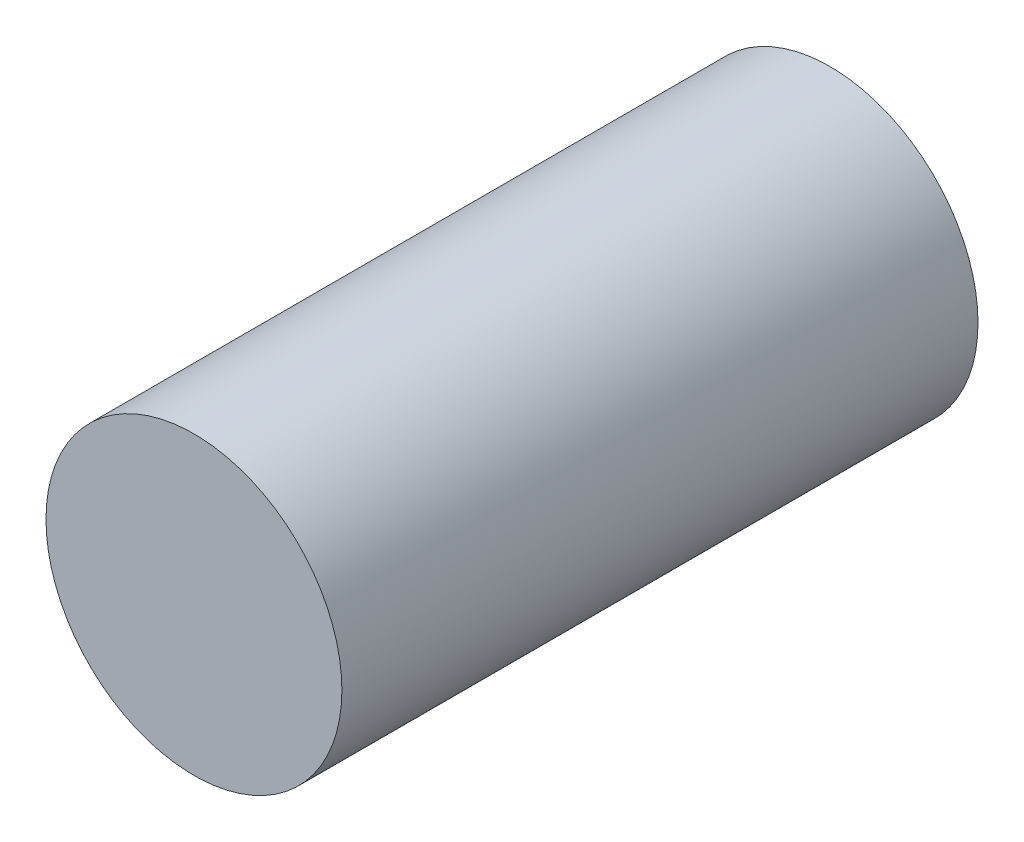
ISO-10303-21;
HEADER;
FILE_DESCRIPTION(('STEP AP214'),'2;1');
FILE_NAME('part.step','',(''),(''),'','','');
FILE_SCHEMA(('AUTOMOTIVE_DESIGN { 1 0 10303 214 1 1 1 1 }'));
ENDSEC;
DATA;
#1=APPLICATION_CONTEXT('core data for automotive mechanical design processes');
#2=APPLICATION_PROTOCOL_DEFINITION('international standard','automotive_design',2000,#1);
#3=PRODUCT_CONTEXT('',#1,'mechanical');
#4=PRODUCT('Part','Part','',(#3));
#5=PRODUCT_RELATED_PRODUCT_CATEGORY('part','',(#4));
#6=PRODUCT_DEFINITION_FORMATION('','',#4);
#7=PRODUCT_DEFINITION_CONTEXT('part definition',#1,'design');
#8=PRODUCT_DEFINITION('design','',#6,#7);
#9=PRODUCT_DEFINITION_SHAPE('','',#8);
#10=(LENGTH_UNIT() NAMED_UNIT(*) SI_UNIT(.MILLI.,.METRE.));
#11=(NAMED_UNIT(*) PLANE_ANGLE_UNIT() SI_UNIT($,.RADIAN.));
#12=(NAMED_UNIT(*) SI_UNIT($,.STERADIAN.) SOLID_ANGLE_UNIT());
#13=UNCERTAINTY_MEASURE_WITH_UNIT(LENGTH_MEASURE(1.E-05),#10,'distance_accuracy_value','');
#14=(GEOMETRIC_REPRESENTATION_CONTEXT(3) GLOBAL_UNCERTAINTY_ASSIGNED_CONTEXT((#13)) GLOBAL_UNIT_ASSIGNED_CONTEXT((#10,
#11,#12)) REPRESENTATION_CONTEXT('',''));
#15=CARTESIAN_POINT('',(0.,0.,0.));
#16=DIRECTION('',(0.,0.,1.));
#17=DIRECTION('',(1.,0.,0.));
#18=AXIS2_PLACEMENT_3D('',#15,#16,#17);
#19=CARTESIAN_POINT('',(0.,0.,27.3));
#20=DIRECTION('',(0.,0.,-1.));
#21=DIRECTION('',(-1.,0.,0.));
#22=AXIS2_PLACEMENT_3D('',#19,#20,#21);
#23=CYLINDRICAL_SURFACE('',#22,6.35);
#24=CARTESIAN_POINT('',(0.,0.,27.3));
#25=DIRECTION('',(0.,0.,1.));
#26=DIRECTION('',(1.,0.,0.));
#27=AXIS2_PLACEMENT_3D('',#24,#25,#26);
#28=CIRCLE('',#27,6.35);
#29=CARTESIAN_POINT('',(6.35,0.,27.3));
#30=VERTEX_POINT('',#29);
#31=EDGE_CURVE('E10',#30,#30,#28,.T.);
#32=ORIENTED_EDGE('',*,*,#31,.F.);
#33=EDGE_LOOP('',(#32));
#34=FACE_BOUND('',#33,.T.);
#35=CARTESIAN_POINT('',(0.,0.,0.));
#36=DIRECTION('',(0.,0.,1.));
#37=DIRECTION('',(1.,0.,0.));
#38=AXIS2_PLACEMENT_3D('',#35,#36,#37);
#39=CIRCLE('',#38,6.35);
#40=CARTESIAN_POINT('',(6.35,0.,0.));
#41=VERTEX_POINT('',#40);
#42=EDGE_CURVE('E42',#41,#41,#39,.T.);
#43=ORIENTED_EDGE('',*,*,#42,.T.);
#44=EDGE_LOOP('',(#43));
#45=FACE_BOUND('',#44,.T.);
#46=ADVANCED_FACE('F39',(#34,#45),#23,.T.);
#47=CARTESIAN_POINT('',(0.,0.,27.3));
#48=DIRECTION('',(0.,0.,1.));
#49=DIRECTION('',(1.,0.,0.));
#50=AXIS2_PLACEMENT_3D('',#47,#48,#49);
#51=PLANE('',#50);
#52=ORIENTED_EDGE('',*,*,#31,.T.);
#53=EDGE_LOOP('',(#52));
#54=FACE_BOUND('',#53,.T.);
#55=ADVANCED_FACE('F54',(#54),#51,.T.);
#56=CARTESIAN_POINT('',(0.,0.,0.));
#57=DIRECTION('',(0.,0.,1.));
#58=DIRECTION('',(1.,0.,0.));
#59=AXIS2_PLACEMENT_3D('',#56,#57,#58);
#60=PLANE('',#59);
#61=ORIENTED_EDGE('',*,*,#42,.F.);
#62=EDGE_LOOP('',(#61));
#63=FACE_BOUND('',#62,.T.);
#64=ADVANCED_FACE('F52',(#63),#60,.F.);
#65=CLOSED_SHELL('',(#46,#55,#64));
#66=MANIFOLD_SOLID_BREP('B2',#65);
#67=ADVANCED_BREP_SHAPE_REPRESENTATION('',(#18,#66),#14);
#68=SHAPE_DEFINITION_REPRESENTATION(#9,#67);
ENDSEC;
END-ISO-10303-21;
